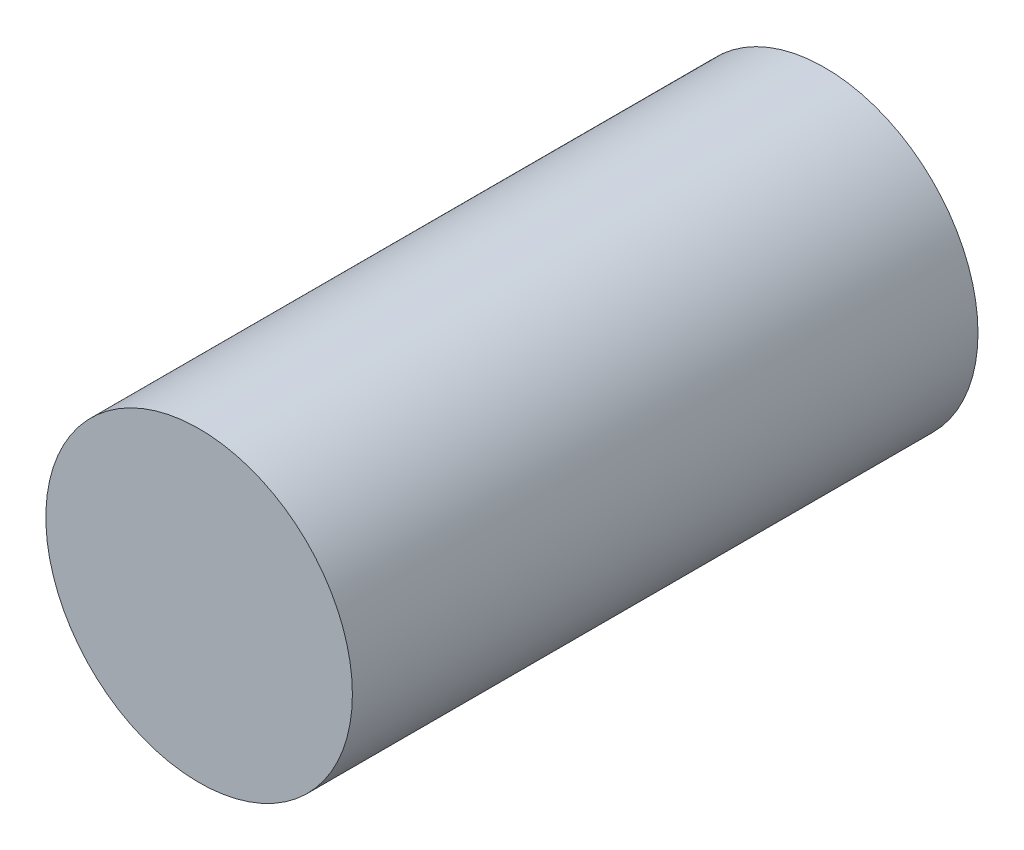
ISO-10303-21;
HEADER;
FILE_DESCRIPTION(('STEP AP214'),'2;1');
FILE_NAME('part.step','',(''),(''),'','','');
FILE_SCHEMA(('AUTOMOTIVE_DESIGN { 1 0 10303 214 1 1 1 1 }'));
ENDSEC;
DATA;
#1=APPLICATION_CONTEXT('core data for automotive mechanical design processes');
#2=APPLICATION_PROTOCOL_DEFINITION('international standard','automotive_design',2000,#1);
#3=PRODUCT_CONTEXT('',#1,'mechanical');
#4=PRODUCT('Part','Part','',(#3));
#5=PRODUCT_RELATED_PRODUCT_CATEGORY('part','',(#4));
#6=PRODUCT_DEFINITION_FORMATION('','',#4);
#7=PRODUCT_DEFINITION_CONTEXT('part definition',#1,'design');
#8=PRODUCT_DEFINITION('design','',#6,#7);
#9=PRODUCT_DEFINITION_SHAPE('','',#8);
#10=(LENGTH_UNIT() NAMED_UNIT(*) SI_UNIT(.MILLI.,.METRE.));
#11=(NAMED_UNIT(*) PLANE_ANGLE_UNIT() SI_UNIT($,.RADIAN.));
#12=(NAMED_UNIT(*) SI_UNIT($,.STERADIAN.) SOLID_ANGLE_UNIT());
#13=UNCERTAINTY_MEASURE_WITH_UNIT(LENGTH_MEASURE(1.E-05),#10,'distance_accuracy_value','');
#14=(GEOMETRIC_REPRESENTATION_CONTEXT(3) GLOBAL_UNCERTAINTY_ASSIGNED_CONTEXT((#13)) GLOBAL_UNIT_ASSIGNED_CONTEXT((#10,
#11,#12)) REPRESENTATION_CONTEXT('',''));
#15=CARTESIAN_POINT('',(0.,0.,0.));
#16=DIRECTION('',(0.,0.,1.));
#17=DIRECTION('',(1.,0.,0.));
#18=AXIS2_PLACEMENT_3D('',#15,#16,#17);
#19=CARTESIAN_POINT('',(0.,0.,20.));
#20=DIRECTION('',(0.,0.,-1.));
#21=DIRECTION('',(-1.,0.,0.));
#22=AXIS2_PLACEMENT_3D('',#19,#20,#21);
#23=CYLINDRICAL_SURFACE('',#22,4.9);
#24=CARTESIAN_POINT('',(0.,0.,20.));
#25=DIRECTION('',(0.,0.,1.));
#26=DIRECTION('',(1.,0.,0.));
#27=AXIS2_PLACEMENT_3D('',#24,#25,#26);
#28=CIRCLE('',#27,4.9);
#29=CARTESIAN_POINT('',(4.9,0.,20.));
#30=VERTEX_POINT('',#29);
#31=EDGE_CURVE('E10',#30,#30,#28,.T.);
#32=ORIENTED_EDGE('',*,*,#31,.F.);
#33=EDGE_LOOP('',(#32));
#34=FACE_BOUND('',#33,.T.);
#35=CARTESIAN_POINT('',(0.,0.,0.));
#36=DIRECTION('',(0.,0.,1.));
#37=DIRECTION('',(1.,0.,0.));
#38=AXIS2_PLACEMENT_3D('',#35,#36,#37);
#39=CIRCLE('',#38,4.9);
#40=CARTESIAN_POINT('',(4.9,0.,0.));
#41=VERTEX_POINT('',#40);
#42=EDGE_CURVE('E44',#41,#41,#39,.T.);
#43=ORIENTED_EDGE('',*,*,#42,.T.);
#44=EDGE_LOOP('',(#43));
#45=FACE_BOUND('',#44,.T.);
#46=ADVANCED_FACE('F41',(#34,#45),#23,.T.);
#47=CARTESIAN_POINT('',(0.,0.,20.));
#48=DIRECTION('',(0.,0.,1.));
#49=DIRECTION('',(1.,0.,0.));
#50=AXIS2_PLACEMENT_3D('',#47,#48,#49);
#51=PLANE('',#50);
#52=ORIENTED_EDGE('',*,*,#31,.T.);
#53=EDGE_LOOP('',(#52));
#54=FACE_BOUND('',#53,.T.);
#55=ADVANCED_FACE('F58',(#54),#51,.T.);
#56=CARTESIAN_POINT('',(0.,0.,0.));
#57=DIRECTION('',(0.,0.,1.));
#58=DIRECTION('',(1.,0.,0.));
#59=AXIS2_PLACEMENT_3D('',#56,#57,#58);
#60=PLANE('',#59);
#61=ORIENTED_EDGE('',*,*,#42,.F.);
#62=EDGE_LOOP('',(#61));
#63=FACE_BOUND('',#62,.T.);
#64=ADVANCED_FACE('F56',(#63),#60,.F.);
#65=CLOSED_SHELL('',(#46,#55,#64));
#66=MANIFOLD_SOLID_BREP('B2',#65);
#67=ADVANCED_BREP_SHAPE_REPRESENTATION('',(#18,#66),#14);
#68=SHAPE_DEFINITION_REPRESENTATION(#9,#67);
ENDSEC;
END-ISO-10303-21;
